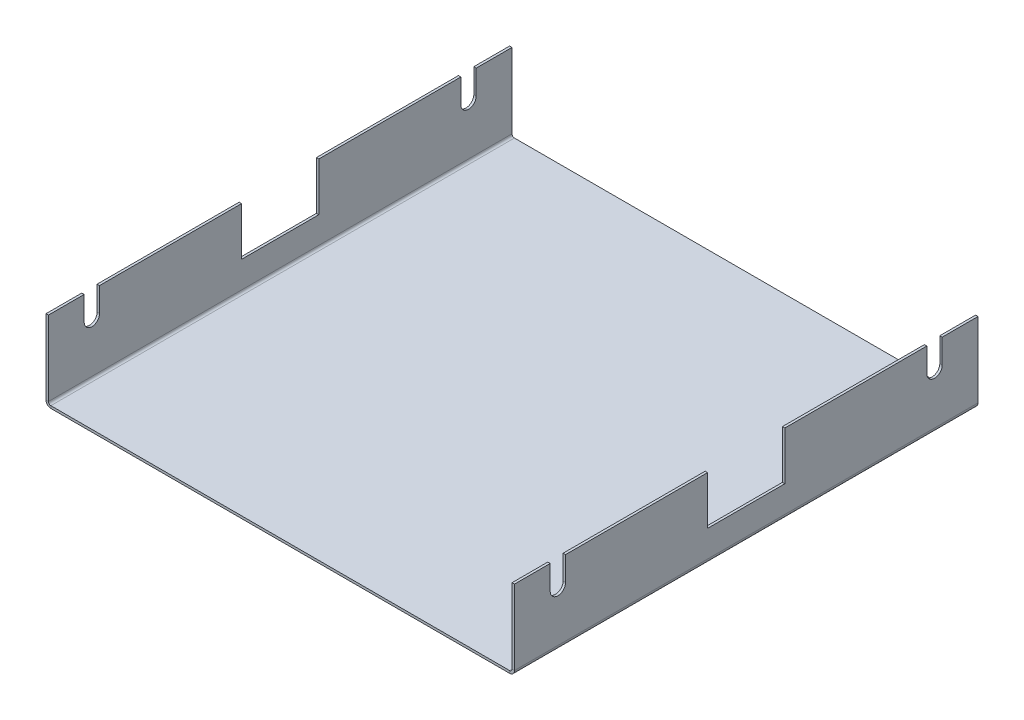
ISO-10303-21;
HEADER;
FILE_DESCRIPTION(('STEP AP214'),'2;1');
FILE_NAME('part.step','',(''),(''),'','','');
FILE_SCHEMA(('AUTOMOTIVE_DESIGN { 1 0 10303 214 1 1 1 1 }'));
ENDSEC;
DATA;
#1=APPLICATION_CONTEXT('core data for automotive mechanical design processes');
#2=APPLICATION_PROTOCOL_DEFINITION('international standard','automotive_design',2000,#1);
#3=PRODUCT_CONTEXT('',#1,'mechanical');
#4=PRODUCT('Part','Part','',(#3));
#5=PRODUCT_RELATED_PRODUCT_CATEGORY('part','',(#4));
#6=PRODUCT_DEFINITION_FORMATION('','',#4);
#7=PRODUCT_DEFINITION_CONTEXT('part definition',#1,'design');
#8=PRODUCT_DEFINITION('design','',#6,#7);
#9=PRODUCT_DEFINITION_SHAPE('','',#8);
#10=(LENGTH_UNIT() NAMED_UNIT(*) SI_UNIT(.MILLI.,.METRE.));
#11=(NAMED_UNIT(*) PLANE_ANGLE_UNIT() SI_UNIT($,.RADIAN.));
#12=(NAMED_UNIT(*) SI_UNIT($,.STERADIAN.) SOLID_ANGLE_UNIT());
#13=UNCERTAINTY_MEASURE_WITH_UNIT(LENGTH_MEASURE(1.E-05),#10,'distance_accuracy_value','');
#14=(GEOMETRIC_REPRESENTATION_CONTEXT(3) GLOBAL_UNCERTAINTY_ASSIGNED_CONTEXT((#13)) GLOBAL_UNIT_ASSIGNED_CONTEXT((#10,
#11,#12)) REPRESENTATION_CONTEXT('',''));
#15=CARTESIAN_POINT('',(0.,0.,0.));
#16=DIRECTION('',(0.,0.,1.));
#17=DIRECTION('',(1.,0.,0.));
#18=AXIS2_PLACEMENT_3D('',#15,#16,#17);
#19=CARTESIAN_POINT('',(-153.9875,50.8,152.4));
#20=DIRECTION('',(0.,1.,0.));
#21=DIRECTION('',(0.,0.,1.));
#22=AXIS2_PLACEMENT_3D('',#19,#20,#21);
#23=PLANE('',#22);
#24=DIRECTION('',(1.,0.,0.));
#25=VECTOR('',#24,1.);
#26=CARTESIAN_POINT('',(-153.9875,50.8,128.8669));
#27=LINE('',#26,#25);
#28=CARTESIAN_POINT('',(-153.9875,50.8,128.8669));
#29=VERTEX_POINT('',#28);
#30=CARTESIAN_POINT('',(-152.4,50.8,128.8669));
#31=VERTEX_POINT('',#30);
#32=EDGE_CURVE('E556',#29,#31,#27,.T.);
#33=ORIENTED_EDGE('',*,*,#32,.F.);
#34=DIRECTION('',(0.,0.,-1.));
#35=VECTOR('',#34,1.);
#36=CARTESIAN_POINT('',(-153.9875,50.8,152.4));
#37=LINE('',#36,#35);
#38=CARTESIAN_POINT('',(-153.9875,50.8,152.4));
#39=VERTEX_POINT('',#38);
#40=EDGE_CURVE('E288',#39,#29,#37,.T.);
#41=ORIENTED_EDGE('',*,*,#40,.F.);
#42=DIRECTION('',(1.,0.,0.));
#43=VECTOR('',#42,1.);
#44=CARTESIAN_POINT('',(-153.9875,50.8,152.4));
#45=LINE('',#44,#43);
#46=CARTESIAN_POINT('',(-152.4,50.8,152.4));
#47=VERTEX_POINT('',#46);
#48=EDGE_CURVE('E362',#39,#47,#45,.T.);
#49=ORIENTED_EDGE('',*,*,#48,.T.);
#50=DIRECTION('',(0.,0.,-1.));
#51=VECTOR('',#50,1.);
#52=CARTESIAN_POINT('',(-152.4,50.8,152.4));
#53=LINE('',#52,#51);
#54=EDGE_CURVE('E470',#47,#31,#53,.T.);
#55=ORIENTED_EDGE('',*,*,#54,.T.);
#56=EDGE_LOOP('',(#33,#41,#49,#55));
#57=FACE_BOUND('',#56,.T.);
#58=ADVANCED_FACE('F35',(#57),#23,.T.);
#59=CARTESIAN_POINT('',(152.4,50.8,152.4));
#60=DIRECTION('',(0.,1.,0.));
#61=DIRECTION('',(0.,0.,1.));
#62=AXIS2_PLACEMENT_3D('',#59,#60,#61);
#63=PLANE('',#62);
#64=CARTESIAN_POINT('',(152.4,50.8,128.8669));
#65=VERTEX_POINT('',#64);
#66=CARTESIAN_POINT('',(153.9875,50.8,128.8669));
#67=VERTEX_POINT('',#66);
#68=EDGE_CURVE('E584',#65,#67,#27,.T.);
#69=ORIENTED_EDGE('',*,*,#68,.F.);
#70=DIRECTION('',(0.,0.,-1.));
#71=VECTOR('',#70,1.);
#72=CARTESIAN_POINT('',(152.4,50.8,152.4));
#73=LINE('',#72,#71);
#74=CARTESIAN_POINT('',(152.4,50.8,152.4));
#75=VERTEX_POINT('',#74);
#76=EDGE_CURVE('E442',#75,#65,#73,.T.);
#77=ORIENTED_EDGE('',*,*,#76,.F.);
#78=DIRECTION('',(1.,0.,0.));
#79=VECTOR('',#78,1.);
#80=CARTESIAN_POINT('',(152.4,50.8,152.4));
#81=LINE('',#80,#79);
#82=CARTESIAN_POINT('',(153.9875,50.8,152.4));
#83=VERTEX_POINT('',#82);
#84=EDGE_CURVE('E380',#75,#83,#81,.T.);
#85=ORIENTED_EDGE('',*,*,#84,.T.);
#86=DIRECTION('',(0.,0.,-1.));
#87=VECTOR('',#86,1.);
#88=CARTESIAN_POINT('',(153.9875,50.8,152.4));
#89=LINE('',#88,#87);
#90=EDGE_CURVE('E448',#83,#67,#89,.T.);
#91=ORIENTED_EDGE('',*,*,#90,.T.);
#92=EDGE_LOOP('',(#69,#77,#85,#91));
#93=FACE_BOUND('',#92,.T.);
#94=ADVANCED_FACE('F631',(#93),#63,.T.);
#95=DIRECTION('',(1.,0.,0.));
#96=VECTOR('',#95,1.);
#97=CARTESIAN_POINT('',(-153.9875,50.8,-128.8669));
#98=LINE('',#97,#96);
#99=CARTESIAN_POINT('',(-153.9875,50.8,-128.8669));
#100=VERTEX_POINT('',#99);
#101=CARTESIAN_POINT('',(-152.4,50.8,-128.8669));
#102=VERTEX_POINT('',#101);
#103=EDGE_CURVE('E548',#100,#102,#98,.T.);
#104=ORIENTED_EDGE('',*,*,#103,.T.);
#105=CARTESIAN_POINT('',(-152.4,50.8,-152.4));
#106=VERTEX_POINT('',#105);
#107=EDGE_CURVE('E467',#102,#106,#53,.T.);
#108=ORIENTED_EDGE('',*,*,#107,.T.);
#109=DIRECTION('',(1.,0.,0.));
#110=VECTOR('',#109,1.);
#111=CARTESIAN_POINT('',(-153.9875,50.8,-152.4));
#112=LINE('',#111,#110);
#113=CARTESIAN_POINT('',(-153.9875,50.8,-152.4));
#114=VERTEX_POINT('',#113);
#115=EDGE_CURVE('E398',#114,#106,#112,.T.);
#116=ORIENTED_EDGE('',*,*,#115,.F.);
#117=EDGE_CURVE('E465',#100,#114,#37,.T.);
#118=ORIENTED_EDGE('',*,*,#117,.F.);
#119=EDGE_LOOP('',(#104,#108,#116,#118));
#120=FACE_BOUND('',#119,.T.);
#121=ADVANCED_FACE('F599',(#120),#23,.T.);
#122=CARTESIAN_POINT('',(152.4,50.8,-128.8669));
#123=VERTEX_POINT('',#122);
#124=CARTESIAN_POINT('',(153.9875,50.8,-128.8669));
#125=VERTEX_POINT('',#124);
#126=EDGE_CURVE('E551',#123,#125,#98,.T.);
#127=ORIENTED_EDGE('',*,*,#126,.T.);
#128=CARTESIAN_POINT('',(153.9875,50.8,-152.4));
#129=VERTEX_POINT('',#128);
#130=EDGE_CURVE('E445',#125,#129,#89,.T.);
#131=ORIENTED_EDGE('',*,*,#130,.T.);
#132=DIRECTION('',(1.,0.,0.));
#133=VECTOR('',#132,1.);
#134=CARTESIAN_POINT('',(152.4,50.8,-152.4));
#135=LINE('',#134,#133);
#136=CARTESIAN_POINT('',(152.4,50.8,-152.4));
#137=VERTEX_POINT('',#136);
#138=EDGE_CURVE('E416',#137,#129,#135,.T.);
#139=ORIENTED_EDGE('',*,*,#138,.F.);
#140=EDGE_CURVE('E441',#123,#137,#73,.T.);
#141=ORIENTED_EDGE('',*,*,#140,.F.);
#142=EDGE_LOOP('',(#127,#131,#139,#141));
#143=FACE_BOUND('',#142,.T.);
#144=ADVANCED_FACE('F639',(#143),#63,.T.);
#145=DIRECTION('',(1.,0.,0.));
#146=VECTOR('',#145,1.);
#147=CARTESIAN_POINT('',(-153.9875,50.8,118.7831));
#148=LINE('',#147,#146);
#149=CARTESIAN_POINT('',(-153.9875,50.8,118.7831));
#150=VERTEX_POINT('',#149);
#151=CARTESIAN_POINT('',(-152.4,50.8,118.7831));
#152=VERTEX_POINT('',#151);
#153=EDGE_CURVE('E581',#150,#152,#148,.T.);
#154=ORIENTED_EDGE('',*,*,#153,.T.);
#155=CARTESIAN_POINT('',(-152.4,50.8,25.4));
#156=VERTEX_POINT('',#155);
#157=EDGE_CURVE('E474',#152,#156,#53,.T.);
#158=ORIENTED_EDGE('',*,*,#157,.T.);
#159=DIRECTION('',(1.,0.,0.));
#160=VECTOR('',#159,1.);
#161=CARTESIAN_POINT('',(-153.9875,50.8,25.4));
#162=LINE('',#161,#160);
#163=CARTESIAN_POINT('',(-153.9875,50.8,25.4));
#164=VERTEX_POINT('',#163);
#165=EDGE_CURVE('E335',#164,#156,#162,.T.);
#166=ORIENTED_EDGE('',*,*,#165,.F.);
#167=EDGE_CURVE('E468',#150,#164,#37,.T.);
#168=ORIENTED_EDGE('',*,*,#167,.F.);
#169=EDGE_LOOP('',(#154,#158,#166,#168));
#170=FACE_BOUND('',#169,.T.);
#171=ADVANCED_FACE('F593',(#170),#23,.T.);
#172=CARTESIAN_POINT('',(152.4,50.8,118.7831));
#173=VERTEX_POINT('',#172);
#174=CARTESIAN_POINT('',(153.9875,50.8,118.7831));
#175=VERTEX_POINT('',#174);
#176=EDGE_CURVE('E580',#173,#175,#148,.T.);
#177=ORIENTED_EDGE('',*,*,#176,.T.);
#178=CARTESIAN_POINT('',(153.9875,50.8,25.4));
#179=VERTEX_POINT('',#178);
#180=EDGE_CURVE('E452',#175,#179,#89,.T.);
#181=ORIENTED_EDGE('',*,*,#180,.T.);
#182=CARTESIAN_POINT('',(152.4,50.8,25.4));
#183=VERTEX_POINT('',#182);
#184=EDGE_CURVE('E339',#183,#179,#162,.T.);
#185=ORIENTED_EDGE('',*,*,#184,.F.);
#186=EDGE_CURVE('E446',#173,#183,#73,.T.);
#187=ORIENTED_EDGE('',*,*,#186,.F.);
#188=EDGE_LOOP('',(#177,#181,#185,#187));
#189=FACE_BOUND('',#188,.T.);
#190=ADVANCED_FACE('F651',(#189),#63,.T.);
#191=CARTESIAN_POINT('',(152.4,1.5875,152.4));
#192=DIRECTION('',(0.,0.,1.));
#193=DIRECTION('',(1.,0.,0.));
#194=AXIS2_PLACEMENT_3D('',#191,#192,#193);
#195=PLANE('',#194);
#196=DIRECTION('',(1.,0.,0.));
#197=VECTOR('',#196,1.);
#198=CARTESIAN_POINT('',(152.4,1.5875,152.4));
#199=LINE('',#198,#197);
#200=CARTESIAN_POINT('',(152.4,1.5875,152.4));
#201=VERTEX_POINT('',#200);
#202=CARTESIAN_POINT('',(153.9875,1.5875,152.4));
#203=VERTEX_POINT('',#202);
#204=EDGE_CURVE('E489',#201,#203,#199,.T.);
#205=ORIENTED_EDGE('',*,*,#204,.F.);
#206=CARTESIAN_POINT('',(150.8125,1.5875,152.4));
#207=DIRECTION('',(0.,0.,1.));
#208=DIRECTION('',(1.,0.,0.));
#209=AXIS2_PLACEMENT_3D('',#206,#207,#208);
#210=CIRCLE('',#209,1.5875);
#211=CARTESIAN_POINT('',(150.8125,0.,152.4));
#212=VERTEX_POINT('',#211);
#213=EDGE_CURVE('E386',#201,#212,#210,.F.);
#214=ORIENTED_EDGE('',*,*,#213,.T.);
#215=DIRECTION('',(0.,1.,0.));
#216=VECTOR('',#215,1.);
#217=CARTESIAN_POINT('',(150.8125,-1.5875,152.4));
#218=LINE('',#217,#216);
#219=CARTESIAN_POINT('',(150.8125,-1.5875,152.4));
#220=VERTEX_POINT('',#219);
#221=EDGE_CURVE('E487',#220,#212,#218,.T.);
#222=ORIENTED_EDGE('',*,*,#221,.F.);
#223=CARTESIAN_POINT('',(150.8125,1.5875,152.4));
#224=DIRECTION('',(0.,0.,1.));
#225=DIRECTION('',(1.,0.,0.));
#226=AXIS2_PLACEMENT_3D('',#223,#224,#225);
#227=CIRCLE('',#226,3.175);
#228=EDGE_CURVE('E374',#203,#220,#227,.F.);
#229=ORIENTED_EDGE('',*,*,#228,.F.);
#230=EDGE_LOOP('',(#205,#214,#222,#229));
#231=FACE_BOUND('',#230,.T.);
#232=ADVANCED_FACE('F37',(#231),#195,.T.);
#233=CARTESIAN_POINT('',(150.8125,-1.5875,152.4));
#234=DIRECTION('',(0.,0.,1.));
#235=DIRECTION('',(1.,0.,0.));
#236=AXIS2_PLACEMENT_3D('',#233,#234,#235);
#237=PLANE('',#236);
#238=DIRECTION('',(0.,-1.,0.));
#239=VECTOR('',#238,1.);
#240=CARTESIAN_POINT('',(152.4,0.,152.4));
#241=LINE('',#240,#239);
#242=EDGE_CURVE('E383',#75,#201,#241,.T.);
#243=ORIENTED_EDGE('',*,*,#242,.T.);
#244=ORIENTED_EDGE('',*,*,#204,.T.);
#245=DIRECTION('',(0.,1.,0.));
#246=VECTOR('',#245,1.);
#247=CARTESIAN_POINT('',(153.9875,0.,152.4));
#248=LINE('',#247,#246);
#249=EDGE_CURVE('E377',#83,#203,#248,.F.);
#250=ORIENTED_EDGE('',*,*,#249,.F.);
#251=ORIENTED_EDGE('',*,*,#84,.F.);
#252=EDGE_LOOP('',(#243,#244,#250,#251));
#253=FACE_BOUND('',#252,.T.);
#254=ADVANCED_FACE('F946',(#253),#237,.T.);
#255=CARTESIAN_POINT('',(150.8125,0.,-152.4));
#256=DIRECTION('',(0.,0.,-1.));
#257=DIRECTION('',(-1.,0.,0.));
#258=AXIS2_PLACEMENT_3D('',#255,#256,#257);
#259=PLANE('',#258);
#260=DIRECTION('',(0.,-1.,0.));
#261=VECTOR('',#260,1.);
#262=CARTESIAN_POINT('',(150.8125,0.,-152.4));
#263=LINE('',#262,#261);
#264=CARTESIAN_POINT('',(150.8125,0.,-152.4));
#265=VERTEX_POINT('',#264);
#266=CARTESIAN_POINT('',(150.8125,-1.5875,-152.4));
#267=VERTEX_POINT('',#266);
#268=EDGE_CURVE('E485',#265,#267,#263,.T.);
#269=ORIENTED_EDGE('',*,*,#268,.F.);
#270=CARTESIAN_POINT('',(150.8125,1.5875,-152.4));
#271=DIRECTION('',(0.,0.,1.));
#272=DIRECTION('',(1.,0.,0.));
#273=AXIS2_PLACEMENT_3D('',#270,#271,#272);
#274=CIRCLE('',#273,1.5875);
#275=CARTESIAN_POINT('',(152.4,1.5875,-152.4));
#276=VERTEX_POINT('',#275);
#277=EDGE_CURVE('E422',#276,#265,#274,.F.);
#278=ORIENTED_EDGE('',*,*,#277,.F.);
#279=DIRECTION('',(-1.,0.,0.));
#280=VECTOR('',#279,1.);
#281=CARTESIAN_POINT('',(153.9875,1.5875,-152.4));
#282=LINE('',#281,#280);
#283=CARTESIAN_POINT('',(153.9875,1.5875,-152.4));
#284=VERTEX_POINT('',#283);
#285=EDGE_CURVE('E483',#284,#276,#282,.T.);
#286=ORIENTED_EDGE('',*,*,#285,.F.);
#287=CARTESIAN_POINT('',(150.8125,1.5875,-152.4));
#288=DIRECTION('',(0.,0.,1.));
#289=DIRECTION('',(1.,0.,0.));
#290=AXIS2_PLACEMENT_3D('',#287,#288,#289);
#291=CIRCLE('',#290,3.175);
#292=EDGE_CURVE('E410',#284,#267,#291,.F.);
#293=ORIENTED_EDGE('',*,*,#292,.T.);
#294=EDGE_LOOP('',(#269,#278,#286,#293));
#295=FACE_BOUND('',#294,.T.);
#296=ADVANCED_FACE('F952',(#295),#259,.T.);
#297=CARTESIAN_POINT('',(153.9875,1.5875,-152.4));
#298=DIRECTION('',(0.,0.,-1.));
#299=DIRECTION('',(-1.,0.,0.));
#300=AXIS2_PLACEMENT_3D('',#297,#298,#299);
#301=PLANE('',#300);
#302=DIRECTION('',(-1.,0.,0.));
#303=VECTOR('',#302,1.);
#304=CARTESIAN_POINT('',(-152.4,0.,-152.4));
#305=LINE('',#304,#303);
#306=CARTESIAN_POINT('',(-150.8125,0.,-152.4));
#307=VERTEX_POINT('',#306);
#308=EDGE_CURVE('E425',#265,#307,#305,.T.);
#309=ORIENTED_EDGE('',*,*,#308,.F.);
#310=ORIENTED_EDGE('',*,*,#268,.T.);
#311=DIRECTION('',(1.,0.,0.));
#312=VECTOR('',#311,1.);
#313=CARTESIAN_POINT('',(-152.4,-1.5875,-152.4));
#314=LINE('',#313,#312);
#315=CARTESIAN_POINT('',(-150.8125,-1.5875,-152.4));
#316=VERTEX_POINT('',#315);
#317=EDGE_CURVE('E407',#267,#316,#314,.F.);
#318=ORIENTED_EDGE('',*,*,#317,.T.);
#319=DIRECTION('',(0.,1.,0.));
#320=VECTOR('',#319,1.);
#321=CARTESIAN_POINT('',(-150.8125,-1.5875,-152.4));
#322=LINE('',#321,#320);
#323=EDGE_CURVE('E473',#316,#307,#322,.T.);
#324=ORIENTED_EDGE('',*,*,#323,.T.);
#325=EDGE_LOOP('',(#309,#310,#318,#324));
#326=FACE_BOUND('',#325,.T.);
#327=ADVANCED_FACE('F957',(#326),#301,.T.);
#328=CARTESIAN_POINT('',(-150.8125,0.,152.4));
#329=DIRECTION('',(0.,0.,1.));
#330=DIRECTION('',(1.,0.,0.));
#331=AXIS2_PLACEMENT_3D('',#328,#329,#330);
#332=PLANE('',#331);
#333=DIRECTION('',(0.,-1.,0.));
#334=VECTOR('',#333,1.);
#335=CARTESIAN_POINT('',(-150.8125,0.,152.4));
#336=LINE('',#335,#334);
#337=CARTESIAN_POINT('',(-150.8125,0.,152.4));
#338=VERTEX_POINT('',#337);
#339=CARTESIAN_POINT('',(-150.8125,-1.5875,152.4));
#340=VERTEX_POINT('',#339);
#341=EDGE_CURVE('E481',#338,#340,#336,.T.);
#342=ORIENTED_EDGE('',*,*,#341,.F.);
#343=CARTESIAN_POINT('',(-150.8125,1.5875,152.4));
#344=DIRECTION('',(0.,0.,1.));
#345=DIRECTION('',(1.,0.,0.));
#346=AXIS2_PLACEMENT_3D('',#343,#344,#345);
#347=CIRCLE('',#346,1.5875);
#348=CARTESIAN_POINT('',(-152.4,1.5875,152.4));
#349=VERTEX_POINT('',#348);
#350=EDGE_CURVE('E392',#338,#349,#347,.F.);
#351=ORIENTED_EDGE('',*,*,#350,.T.);
#352=DIRECTION('',(1.,0.,0.));
#353=VECTOR('',#352,1.);
#354=CARTESIAN_POINT('',(-153.9875,1.5875,152.4));
#355=LINE('',#354,#353);
#356=CARTESIAN_POINT('',(-153.9875,1.5875,152.4));
#357=VERTEX_POINT('',#356);
#358=EDGE_CURVE('E479',#357,#349,#355,.T.);
#359=ORIENTED_EDGE('',*,*,#358,.F.);
#360=CARTESIAN_POINT('',(-150.8125,1.5875,152.4));
#361=DIRECTION('',(0.,0.,1.));
#362=DIRECTION('',(1.,0.,0.));
#363=AXIS2_PLACEMENT_3D('',#360,#361,#362);
#364=CIRCLE('',#363,3.175);
#365=EDGE_CURVE('E368',#340,#357,#364,.F.);
#366=ORIENTED_EDGE('',*,*,#365,.F.);
#367=EDGE_LOOP('',(#342,#351,#359,#366));
#368=FACE_BOUND('',#367,.T.);
#369=ADVANCED_FACE('F972',(#368),#332,.T.);
#370=CARTESIAN_POINT('',(-153.9875,1.5875,152.4));
#371=DIRECTION('',(0.,0.,1.));
#372=DIRECTION('',(1.,0.,0.));
#373=AXIS2_PLACEMENT_3D('',#370,#371,#372);
#374=PLANE('',#373);
#375=DIRECTION('',(-1.,0.,0.));
#376=VECTOR('',#375,1.);
#377=CARTESIAN_POINT('',(-152.4,0.,152.4));
#378=LINE('',#377,#376);
#379=EDGE_CURVE('E389',#212,#338,#378,.T.);
#380=ORIENTED_EDGE('',*,*,#379,.T.);
#381=ORIENTED_EDGE('',*,*,#341,.T.);
#382=DIRECTION('',(1.,0.,0.));
#383=VECTOR('',#382,1.);
#384=CARTESIAN_POINT('',(-152.4,-1.5875,152.4));
#385=LINE('',#384,#383);
#386=EDGE_CURVE('E371',#220,#340,#385,.F.);
#387=ORIENTED_EDGE('',*,*,#386,.F.);
#388=ORIENTED_EDGE('',*,*,#221,.T.);
#389=EDGE_LOOP('',(#380,#381,#387,#388));
#390=FACE_BOUND('',#389,.T.);
#391=ADVANCED_FACE('F977',(#390),#374,.T.);
#392=CARTESIAN_POINT('',(-152.4,1.5875,-152.4));
#393=DIRECTION('',(0.,0.,-1.));
#394=DIRECTION('',(-1.,0.,0.));
#395=AXIS2_PLACEMENT_3D('',#392,#393,#394);
#396=PLANE('',#395);
#397=DIRECTION('',(-1.,0.,0.));
#398=VECTOR('',#397,1.);
#399=CARTESIAN_POINT('',(-152.4,1.5875,-152.4));
#400=LINE('',#399,#398);
#401=CARTESIAN_POINT('',(-152.4,1.5875,-152.4));
#402=VERTEX_POINT('',#401);
#403=CARTESIAN_POINT('',(-153.9875,1.5875,-152.4));
#404=VERTEX_POINT('',#403);
#405=EDGE_CURVE('E477',#402,#404,#400,.T.);
#406=ORIENTED_EDGE('',*,*,#405,.F.);
#407=CARTESIAN_POINT('',(-150.8125,1.5875,-152.4));
#408=DIRECTION('',(0.,0.,1.));
#409=DIRECTION('',(1.,0.,0.));
#410=AXIS2_PLACEMENT_3D('',#407,#408,#409);
#411=CIRCLE('',#410,1.5875);
#412=EDGE_CURVE('E363',#307,#402,#411,.F.);
#413=ORIENTED_EDGE('',*,*,#412,.F.);
#414=ORIENTED_EDGE('',*,*,#323,.F.);
#415=CARTESIAN_POINT('',(-150.8125,1.5875,-152.4));
#416=DIRECTION('',(0.,0.,1.));
#417=DIRECTION('',(1.,0.,0.));
#418=AXIS2_PLACEMENT_3D('',#415,#416,#417);
#419=CIRCLE('',#418,3.175);
#420=EDGE_CURVE('E404',#316,#404,#419,.F.);
#421=ORIENTED_EDGE('',*,*,#420,.T.);
#422=EDGE_LOOP('',(#406,#413,#414,#421));
#423=FACE_BOUND('',#422,.T.);
#424=ADVANCED_FACE('F984',(#423),#396,.T.);
#425=CARTESIAN_POINT('',(-150.8125,-1.5875,-152.4));
#426=DIRECTION('',(0.,0.,-1.));
#427=DIRECTION('',(-1.,0.,0.));
#428=AXIS2_PLACEMENT_3D('',#425,#426,#427);
#429=PLANE('',#428);
#430=DIRECTION('',(0.,1.,0.));
#431=VECTOR('',#430,1.);
#432=CARTESIAN_POINT('',(-152.4,0.,-152.4));
#433=LINE('',#432,#431);
#434=EDGE_CURVE('E359',#402,#106,#433,.T.);
#435=ORIENTED_EDGE('',*,*,#434,.F.);
#436=ORIENTED_EDGE('',*,*,#405,.T.);
#437=DIRECTION('',(0.,1.,0.));
#438=VECTOR('',#437,1.);
#439=CARTESIAN_POINT('',(-153.9875,0.,-152.4));
#440=LINE('',#439,#438);
#441=EDGE_CURVE('E401',#404,#114,#440,.T.);
#442=ORIENTED_EDGE('',*,*,#441,.T.);
#443=ORIENTED_EDGE('',*,*,#115,.T.);
#444=EDGE_LOOP('',(#435,#436,#442,#443));
#445=FACE_BOUND('',#444,.T.);
#446=ADVANCED_FACE('F602',(#445),#429,.T.);
#447=CARTESIAN_POINT('',(-152.4,0.,152.4));
#448=DIRECTION('',(-1.,0.,0.));
#449=DIRECTION('',(0.,0.,1.));
#450=AXIS2_PLACEMENT_3D('',#447,#448,#449);
#451=PLANE('',#450);
#452=CARTESIAN_POINT('',(-152.4,34.925,123.825));
#453=DIRECTION('',(-1.,0.,0.));
#454=DIRECTION('',(0.,0.,1.));
#455=AXIS2_PLACEMENT_3D('',#452,#453,#454);
#456=CIRCLE('',#455,5.04189999999995);
#457=CARTESIAN_POINT('',(-152.4,34.925,118.7831));
#458=VERTEX_POINT('',#457);
#459=CARTESIAN_POINT('',(-152.4,34.925,128.8669));
#460=VERTEX_POINT('',#459);
#461=EDGE_CURVE('E293',#458,#460,#456,.T.);
#462=ORIENTED_EDGE('',*,*,#461,.T.);
#463=DIRECTION('',(0.,1.,0.));
#464=VECTOR('',#463,1.);
#465=CARTESIAN_POINT('',(-152.4,0.,128.8669));
#466=LINE('',#465,#464);
#467=EDGE_CURVE('E273',#460,#31,#466,.T.);
#468=ORIENTED_EDGE('',*,*,#467,.T.);
#469=ORIENTED_EDGE('',*,*,#54,.F.);
#470=DIRECTION('',(0.,1.,0.));
#471=VECTOR('',#470,1.);
#472=CARTESIAN_POINT('',(-152.4,0.,152.4));
#473=LINE('',#472,#471);
#474=EDGE_CURVE('E360',#349,#47,#473,.T.);
#475=ORIENTED_EDGE('',*,*,#474,.F.);
#476=DIRECTION('',(0.,0.,-1.));
#477=VECTOR('',#476,1.);
#478=CARTESIAN_POINT('',(-152.4,1.5875,152.4));
#479=LINE('',#478,#477);
#480=EDGE_CURVE('E395',#349,#402,#479,.T.);
#481=ORIENTED_EDGE('',*,*,#480,.T.);
#482=ORIENTED_EDGE('',*,*,#434,.T.);
#483=ORIENTED_EDGE('',*,*,#107,.F.);
#484=DIRECTION('',(0.,-1.,0.));
#485=VECTOR('',#484,1.);
#486=CARTESIAN_POINT('',(-152.4,0.,-128.8669));
#487=LINE('',#486,#485);
#488=CARTESIAN_POINT('',(-152.4,34.925,-128.8669));
#489=VERTEX_POINT('',#488);
#490=EDGE_CURVE('E299',#102,#489,#487,.T.);
#491=ORIENTED_EDGE('',*,*,#490,.T.);
#492=CARTESIAN_POINT('',(-152.4,34.925,-123.825));
#493=DIRECTION('',(-1.,0.,0.));
#494=DIRECTION('',(0.,0.,1.));
#495=AXIS2_PLACEMENT_3D('',#492,#493,#494);
#496=CIRCLE('',#495,5.04189999999995);
#497=CARTESIAN_POINT('',(-152.4,34.925,-118.7831));
#498=VERTEX_POINT('',#497);
#499=EDGE_CURVE('E314',#489,#498,#496,.T.);
#500=ORIENTED_EDGE('',*,*,#499,.T.);
#501=DIRECTION('',(0.,1.,0.));
#502=VECTOR('',#501,1.);
#503=CARTESIAN_POINT('',(-152.4,0.,-118.7831));
#504=LINE('',#503,#502);
#505=CARTESIAN_POINT('',(-152.4,50.8,-118.7831));
#506=VERTEX_POINT('',#505);
#507=EDGE_CURVE('E50',#498,#506,#504,.T.);
#508=ORIENTED_EDGE('',*,*,#507,.T.);
#509=CARTESIAN_POINT('',(-152.4,50.8,-25.4));
#510=VERTEX_POINT('',#509);
#511=EDGE_CURVE('E475',#510,#506,#53,.T.);
#512=ORIENTED_EDGE('',*,*,#511,.F.);
#513=DIRECTION('',(0.,-1.,0.));
#514=VECTOR('',#513,1.);
#515=CARTESIAN_POINT('',(-152.4,0.,-25.4));
#516=LINE('',#515,#514);
#517=CARTESIAN_POINT('',(-152.4,19.05,-25.4));
#518=VERTEX_POINT('',#517);
#519=EDGE_CURVE('E353',#510,#518,#516,.T.);
#520=ORIENTED_EDGE('',*,*,#519,.T.);
#521=DIRECTION('',(0.,0.,1.));
#522=VECTOR('',#521,1.);
#523=CARTESIAN_POINT('',(-152.4,19.05,152.4));
#524=LINE('',#523,#522);
#525=CARTESIAN_POINT('',(-152.4,19.05,25.4));
#526=VERTEX_POINT('',#525);
#527=EDGE_CURVE('E338',#518,#526,#524,.T.);
#528=ORIENTED_EDGE('',*,*,#527,.T.);
#529=DIRECTION('',(0.,1.,0.));
#530=VECTOR('',#529,1.);
#531=CARTESIAN_POINT('',(-152.4,0.,25.4));
#532=LINE('',#531,#530);
#533=EDGE_CURVE('E356',#526,#156,#532,.T.);
#534=ORIENTED_EDGE('',*,*,#533,.T.);
#535=ORIENTED_EDGE('',*,*,#157,.F.);
#536=DIRECTION('',(0.,-1.,0.));
#537=VECTOR('',#536,1.);
#538=CARTESIAN_POINT('',(-152.4,0.,118.7831));
#539=LINE('',#538,#537);
#540=EDGE_CURVE('E555',#152,#458,#539,.T.);
#541=ORIENTED_EDGE('',*,*,#540,.T.);
#542=EDGE_LOOP('',(#462,#468,#469,#475,#481,#482,#483,#491,#500,#508,#512,#520,#528,#534,#535,#541));
#543=FACE_BOUND('',#542,.T.);
#544=ADVANCED_FACE('F568',(#543),#451,.F.);
#545=DIRECTION('',(1.,0.,0.));
#546=VECTOR('',#545,1.);
#547=CARTESIAN_POINT('',(-153.9875,50.8,-118.7831));
#548=LINE('',#547,#546);
#549=CARTESIAN_POINT('',(-153.9875,50.8,-118.7831));
#550=VERTEX_POINT('',#549);
#551=EDGE_CURVE('E545',#550,#506,#548,.T.);
#552=ORIENTED_EDGE('',*,*,#551,.F.);
#553=CARTESIAN_POINT('',(-153.9875,50.8,-25.4));
#554=VERTEX_POINT('',#553);
#555=EDGE_CURVE('E469',#554,#550,#37,.T.);
#556=ORIENTED_EDGE('',*,*,#555,.F.);
#557=DIRECTION('',(1.,0.,0.));
#558=VECTOR('',#557,1.);
#559=CARTESIAN_POINT('',(-153.9875,50.8,-25.4));
#560=LINE('',#559,#558);
#561=EDGE_CURVE('E340',#554,#510,#560,.T.);
#562=ORIENTED_EDGE('',*,*,#561,.T.);
#563=ORIENTED_EDGE('',*,*,#511,.T.);
#564=EDGE_LOOP('',(#552,#556,#562,#563));
#565=FACE_BOUND('',#564,.T.);
#566=ADVANCED_FACE('F633',(#565),#23,.T.);
#567=CARTESIAN_POINT('',(-153.9875,0.,152.4));
#568=DIRECTION('',(-1.,0.,0.));
#569=DIRECTION('',(0.,0.,1.));
#570=AXIS2_PLACEMENT_3D('',#567,#568,#569);
#571=PLANE('',#570);
#572=DIRECTION('',(0.,-1.,0.));
#573=VECTOR('',#572,1.);
#574=CARTESIAN_POINT('',(-153.9875,50.8,128.8669));
#575=LINE('',#574,#573);
#576=CARTESIAN_POINT('',(-153.9875,34.925,128.8669));
#577=VERTEX_POINT('',#576);
#578=EDGE_CURVE('E270',#29,#577,#575,.T.);
#579=ORIENTED_EDGE('',*,*,#578,.T.);
#580=CARTESIAN_POINT('',(-153.9875,34.925,123.825));
#581=DIRECTION('',(1.,0.,0.));
#582=DIRECTION('',(0.,0.,-1.));
#583=AXIS2_PLACEMENT_3D('',#580,#581,#582);
#584=CIRCLE('',#583,5.04189999999989);
#585=CARTESIAN_POINT('',(-153.9875,34.925,118.7831));
#586=VERTEX_POINT('',#585);
#587=EDGE_CURVE('E286',#577,#586,#584,.T.);
#588=ORIENTED_EDGE('',*,*,#587,.T.);
#589=DIRECTION('',(0.,1.,0.));
#590=VECTOR('',#589,1.);
#591=CARTESIAN_POINT('',(-153.9875,50.8,118.7831));
#592=LINE('',#591,#590);
#593=EDGE_CURVE('E279',#586,#150,#592,.T.);
#594=ORIENTED_EDGE('',*,*,#593,.T.);
#595=ORIENTED_EDGE('',*,*,#167,.T.);
#596=DIRECTION('',(0.,-1.,0.));
#597=VECTOR('',#596,1.);
#598=CARTESIAN_POINT('',(-153.9875,50.8,25.4));
#599=LINE('',#598,#597);
#600=CARTESIAN_POINT('',(-153.9875,19.05,25.4));
#601=VERTEX_POINT('',#600);
#602=EDGE_CURVE('E318',#164,#601,#599,.T.);
#603=ORIENTED_EDGE('',*,*,#602,.T.);
#604=DIRECTION('',(0.,0.,-1.));
#605=VECTOR('',#604,1.);
#606=CARTESIAN_POINT('',(-153.9875,19.05,25.4));
#607=LINE('',#606,#605);
#608=CARTESIAN_POINT('',(-153.9875,19.05,-25.4));
#609=VERTEX_POINT('',#608);
#610=EDGE_CURVE('E321',#601,#609,#607,.T.);
#611=ORIENTED_EDGE('',*,*,#610,.T.);
#612=DIRECTION('',(0.,1.,0.));
#613=VECTOR('',#612,1.);
#614=CARTESIAN_POINT('',(-153.9875,50.8,-25.4));
#615=LINE('',#614,#613);
#616=EDGE_CURVE('E325',#609,#554,#615,.T.);
#617=ORIENTED_EDGE('',*,*,#616,.T.);
#618=ORIENTED_EDGE('',*,*,#555,.T.);
#619=DIRECTION('',(0.,-1.,0.));
#620=VECTOR('',#619,1.);
#621=CARTESIAN_POINT('',(-153.9875,50.8,-118.7831));
#622=LINE('',#621,#620);
#623=CARTESIAN_POINT('',(-153.9875,34.925,-118.7831));
#624=VERTEX_POINT('',#623);
#625=EDGE_CURVE('E537',#550,#624,#622,.T.);
#626=ORIENTED_EDGE('',*,*,#625,.T.);
#627=CARTESIAN_POINT('',(-153.9875,34.925,-123.825));
#628=DIRECTION('',(1.,0.,0.));
#629=DIRECTION('',(0.,0.,-1.));
#630=AXIS2_PLACEMENT_3D('',#627,#628,#629);
#631=CIRCLE('',#630,5.04189999999989);
#632=CARTESIAN_POINT('',(-153.9875,34.925,-128.8669));
#633=VERTEX_POINT('',#632);
#634=EDGE_CURVE('E308',#624,#633,#631,.T.);
#635=ORIENTED_EDGE('',*,*,#634,.T.);
#636=DIRECTION('',(0.,1.,0.));
#637=VECTOR('',#636,1.);
#638=CARTESIAN_POINT('',(-153.9875,50.8,-128.8669));
#639=LINE('',#638,#637);
#640=EDGE_CURVE('E58',#633,#100,#639,.T.);
#641=ORIENTED_EDGE('',*,*,#640,.T.);
#642=ORIENTED_EDGE('',*,*,#117,.T.);
#643=ORIENTED_EDGE('',*,*,#441,.F.);
#644=DIRECTION('',(0.,0.,-1.));
#645=VECTOR('',#644,1.);
#646=CARTESIAN_POINT('',(-153.9875,1.5875,152.4));
#647=LINE('',#646,#645);
#648=EDGE_CURVE('E462',#357,#404,#647,.T.);
#649=ORIENTED_EDGE('',*,*,#648,.F.);
#650=DIRECTION('',(0.,1.,0.));
#651=VECTOR('',#650,1.);
#652=CARTESIAN_POINT('',(-153.9875,0.,152.4));
#653=LINE('',#652,#651);
#654=EDGE_CURVE('E366',#357,#39,#653,.T.);
#655=ORIENTED_EDGE('',*,*,#654,.T.);
#656=ORIENTED_EDGE('',*,*,#40,.T.);
#657=EDGE_LOOP('',(#579,#588,#594,#595,#603,#611,#617,#618,#626,#635,#641,#642,#643,#649,#655,#656));
#658=FACE_BOUND('',#657,.T.);
#659=ADVANCED_FACE('F284',(#658),#571,.T.);
#660=CARTESIAN_POINT('',(-150.8125,1.5875,152.4));
#661=DIRECTION('',(0.,0.,-1.));
#662=DIRECTION('',(-1.,0.,0.));
#663=AXIS2_PLACEMENT_3D('',#660,#661,#662);
#664=CYLINDRICAL_SURFACE('',#663,3.175);
#665=ORIENTED_EDGE('',*,*,#420,.F.);
#666=DIRECTION('',(0.,0.,-1.));
#667=VECTOR('',#666,1.);
#668=CARTESIAN_POINT('',(-150.8125,-1.5875,152.4));
#669=LINE('',#668,#667);
#670=EDGE_CURVE('E459',#340,#316,#669,.T.);
#671=ORIENTED_EDGE('',*,*,#670,.F.);
#672=ORIENTED_EDGE('',*,*,#365,.T.);
#673=ORIENTED_EDGE('',*,*,#648,.T.);
#674=EDGE_LOOP('',(#665,#671,#672,#673));
#675=FACE_BOUND('',#674,.T.);
#676=ADVANCED_FACE('F607',(#675),#664,.T.);
#677=CARTESIAN_POINT('',(-152.4,-1.5875,152.4));
#678=DIRECTION('',(0.,-1.,0.));
#679=DIRECTION('',(0.,0.,-1.));
#680=AXIS2_PLACEMENT_3D('',#677,#678,#679);
#681=PLANE('',#680);
#682=ORIENTED_EDGE('',*,*,#317,.F.);
#683=DIRECTION('',(0.,0.,-1.));
#684=VECTOR('',#683,1.);
#685=CARTESIAN_POINT('',(150.8125,-1.5875,152.4));
#686=LINE('',#685,#684);
#687=EDGE_CURVE('E456',#220,#267,#686,.T.);
#688=ORIENTED_EDGE('',*,*,#687,.F.);
#689=ORIENTED_EDGE('',*,*,#386,.T.);
#690=ORIENTED_EDGE('',*,*,#670,.T.);
#691=EDGE_LOOP('',(#682,#688,#689,#690));
#692=FACE_BOUND('',#691,.T.);
#693=ADVANCED_FACE('F670',(#692),#681,.T.);
#694=CARTESIAN_POINT('',(150.8125,1.5875,152.4));
#695=DIRECTION('',(0.,0.,-1.));
#696=DIRECTION('',(-1.,0.,0.));
#697=AXIS2_PLACEMENT_3D('',#694,#695,#696);
#698=CYLINDRICAL_SURFACE('',#697,3.175);
#699=ORIENTED_EDGE('',*,*,#292,.F.);
#700=DIRECTION('',(0.,0.,-1.));
#701=VECTOR('',#700,1.);
#702=CARTESIAN_POINT('',(153.9875,1.5875,152.4));
#703=LINE('',#702,#701);
#704=EDGE_CURVE('E451',#203,#284,#703,.T.);
#705=ORIENTED_EDGE('',*,*,#704,.F.);
#706=ORIENTED_EDGE('',*,*,#228,.T.);
#707=ORIENTED_EDGE('',*,*,#687,.T.);
#708=EDGE_LOOP('',(#699,#705,#706,#707));
#709=FACE_BOUND('',#708,.T.);
#710=ADVANCED_FACE('F667',(#709),#698,.T.);
#711=CARTESIAN_POINT('',(153.9875,0.,152.4));
#712=DIRECTION('',(1.,0.,0.));
#713=DIRECTION('',(0.,0.,-1.));
#714=AXIS2_PLACEMENT_3D('',#711,#712,#713);
#715=PLANE('',#714);
#716=DIRECTION('',(0.,-1.,0.));
#717=VECTOR('',#716,1.);
#718=CARTESIAN_POINT('',(153.9875,50.8,128.8669));
#719=LINE('',#718,#717);
#720=CARTESIAN_POINT('',(153.9875,34.925,128.8669));
#721=VERTEX_POINT('',#720);
#722=EDGE_CURVE('E542',#67,#721,#719,.T.);
#723=ORIENTED_EDGE('',*,*,#722,.F.);
#724=ORIENTED_EDGE('',*,*,#90,.F.);
#725=ORIENTED_EDGE('',*,*,#249,.T.);
#726=ORIENTED_EDGE('',*,*,#704,.T.);
#727=DIRECTION('',(0.,1.,0.));
#728=VECTOR('',#727,1.);
#729=CARTESIAN_POINT('',(153.9875,0.,-152.4));
#730=LINE('',#729,#728);
#731=EDGE_CURVE('E413',#129,#284,#730,.F.);
#732=ORIENTED_EDGE('',*,*,#731,.F.);
#733=ORIENTED_EDGE('',*,*,#130,.F.);
#734=DIRECTION('',(0.,1.,0.));
#735=VECTOR('',#734,1.);
#736=CARTESIAN_POINT('',(153.9875,50.8,-128.8669));
#737=LINE('',#736,#735);
#738=CARTESIAN_POINT('',(153.9875,34.925,-128.8669));
#739=VERTEX_POINT('',#738);
#740=EDGE_CURVE('E526',#739,#125,#737,.T.);
#741=ORIENTED_EDGE('',*,*,#740,.F.);
#742=CARTESIAN_POINT('',(153.9875,34.925,-123.825));
#743=DIRECTION('',(1.,0.,0.));
#744=DIRECTION('',(0.,0.,-1.));
#745=AXIS2_PLACEMENT_3D('',#742,#743,#744);
#746=CIRCLE('',#745,5.0419);
#747=CARTESIAN_POINT('',(153.9875,34.925,-118.7831));
#748=VERTEX_POINT('',#747);
#749=EDGE_CURVE('E305',#748,#739,#746,.T.);
#750=ORIENTED_EDGE('',*,*,#749,.F.);
#751=DIRECTION('',(0.,-1.,0.));
#752=VECTOR('',#751,1.);
#753=CARTESIAN_POINT('',(153.9875,50.8,-118.7831));
#754=LINE('',#753,#752);
#755=CARTESIAN_POINT('',(153.9875,50.8,-118.7831));
#756=VERTEX_POINT('',#755);
#757=EDGE_CURVE('E512',#756,#748,#754,.T.);
#758=ORIENTED_EDGE('',*,*,#757,.F.);
#759=CARTESIAN_POINT('',(153.9875,50.8,-25.4));
#760=VERTEX_POINT('',#759);
#761=EDGE_CURVE('E453',#760,#756,#89,.T.);
#762=ORIENTED_EDGE('',*,*,#761,.F.);
#763=DIRECTION('',(0.,1.,0.));
#764=VECTOR('',#763,1.);
#765=CARTESIAN_POINT('',(153.9875,50.8,-25.4));
#766=LINE('',#765,#764);
#767=CARTESIAN_POINT('',(153.9875,19.05,-25.4));
#768=VERTEX_POINT('',#767);
#769=EDGE_CURVE('E322',#768,#760,#766,.T.);
#770=ORIENTED_EDGE('',*,*,#769,.F.);
#771=DIRECTION('',(0.,0.,-1.));
#772=VECTOR('',#771,1.);
#773=CARTESIAN_POINT('',(153.9875,19.05,25.4));
#774=LINE('',#773,#772);
#775=CARTESIAN_POINT('',(153.9875,19.05,25.4));
#776=VERTEX_POINT('',#775);
#777=EDGE_CURVE('E331',#776,#768,#774,.T.);
#778=ORIENTED_EDGE('',*,*,#777,.F.);
#779=DIRECTION('',(0.,-1.,0.));
#780=VECTOR('',#779,1.);
#781=CARTESIAN_POINT('',(153.9875,50.8,25.4));
#782=LINE('',#781,#780);
#783=EDGE_CURVE('E317',#179,#776,#782,.T.);
#784=ORIENTED_EDGE('',*,*,#783,.F.);
#785=ORIENTED_EDGE('',*,*,#180,.F.);
#786=DIRECTION('',(0.,1.,0.));
#787=VECTOR('',#786,1.);
#788=CARTESIAN_POINT('',(153.9875,50.8,118.7831));
#789=LINE('',#788,#787);
#790=CARTESIAN_POINT('',(153.9875,34.925,118.7831));
#791=VERTEX_POINT('',#790);
#792=EDGE_CURVE('E289',#791,#175,#789,.T.);
#793=ORIENTED_EDGE('',*,*,#792,.F.);
#794=CARTESIAN_POINT('',(153.9875,34.925,123.825));
#795=DIRECTION('',(1.,0.,0.));
#796=DIRECTION('',(0.,0.,-1.));
#797=AXIS2_PLACEMENT_3D('',#794,#795,#796);
#798=CIRCLE('',#797,5.0419);
#799=EDGE_CURVE('E294',#721,#791,#798,.T.);
#800=ORIENTED_EDGE('',*,*,#799,.F.);
#801=EDGE_LOOP('',(#723,#724,#725,#726,#732,#733,#741,#750,#758,#762,#770,#778,#784,#785,#793,#800));
#802=FACE_BOUND('',#801,.T.);
#803=ADVANCED_FACE('F532',(#802),#715,.T.);
#804=CARTESIAN_POINT('',(152.4,50.8,-118.7831));
#805=VERTEX_POINT('',#804);
#806=EDGE_CURVE('E547',#805,#756,#548,.T.);
#807=ORIENTED_EDGE('',*,*,#806,.F.);
#808=CARTESIAN_POINT('',(152.4,50.8,-25.4));
#809=VERTEX_POINT('',#808);
#810=EDGE_CURVE('E447',#809,#805,#73,.T.);
#811=ORIENTED_EDGE('',*,*,#810,.F.);
#812=EDGE_CURVE('E343',#809,#760,#560,.T.);
#813=ORIENTED_EDGE('',*,*,#812,.T.);
#814=ORIENTED_EDGE('',*,*,#761,.T.);
#815=EDGE_LOOP('',(#807,#811,#813,#814));
#816=FACE_BOUND('',#815,.T.);
#817=ADVANCED_FACE('F640',(#816),#63,.T.);
#818=CARTESIAN_POINT('',(152.4,0.,152.4));
#819=DIRECTION('',(1.,0.,0.));
#820=DIRECTION('',(0.,0.,-1.));
#821=AXIS2_PLACEMENT_3D('',#818,#819,#820);
#822=PLANE('',#821);
#823=ORIENTED_EDGE('',*,*,#76,.T.);
#824=DIRECTION('',(0.,-1.,0.));
#825=VECTOR('',#824,1.);
#826=CARTESIAN_POINT('',(152.4,0.,128.8669));
#827=LINE('',#826,#825);
#828=CARTESIAN_POINT('',(152.4,34.925,128.8669));
#829=VERTEX_POINT('',#828);
#830=EDGE_CURVE('E559',#65,#829,#827,.T.);
#831=ORIENTED_EDGE('',*,*,#830,.T.);
#832=CARTESIAN_POINT('',(152.4,34.925,123.825));
#833=DIRECTION('',(1.,0.,0.));
#834=DIRECTION('',(0.,0.,-1.));
#835=AXIS2_PLACEMENT_3D('',#832,#833,#834);
#836=CIRCLE('',#835,5.04189999999995);
#837=CARTESIAN_POINT('',(152.4,34.925,118.7831));
#838=VERTEX_POINT('',#837);
#839=EDGE_CURVE('E296',#829,#838,#836,.T.);
#840=ORIENTED_EDGE('',*,*,#839,.T.);
#841=DIRECTION('',(0.,1.,0.));
#842=VECTOR('',#841,1.);
#843=CARTESIAN_POINT('',(152.4,0.,118.7831));
#844=LINE('',#843,#842);
#845=EDGE_CURVE('E552',#838,#173,#844,.T.);
#846=ORIENTED_EDGE('',*,*,#845,.T.);
#847=ORIENTED_EDGE('',*,*,#186,.T.);
#848=DIRECTION('',(0.,-1.,0.));
#849=VECTOR('',#848,1.);
#850=CARTESIAN_POINT('',(152.4,0.,25.4));
#851=LINE('',#850,#849);
#852=CARTESIAN_POINT('',(152.4,19.05,25.4));
#853=VERTEX_POINT('',#852);
#854=EDGE_CURVE('E497',#183,#853,#851,.T.);
#855=ORIENTED_EDGE('',*,*,#854,.T.);
#856=DIRECTION('',(0.,0.,-1.));
#857=VECTOR('',#856,1.);
#858=CARTESIAN_POINT('',(152.4,19.05,152.4));
#859=LINE('',#858,#857);
#860=CARTESIAN_POINT('',(152.4,19.05,-25.4));
#861=VERTEX_POINT('',#860);
#862=EDGE_CURVE('E491',#853,#861,#859,.T.);
#863=ORIENTED_EDGE('',*,*,#862,.T.);
#864=DIRECTION('',(0.,1.,0.));
#865=VECTOR('',#864,1.);
#866=CARTESIAN_POINT('',(152.4,0.,-25.4));
#867=LINE('',#866,#865);
#868=EDGE_CURVE('E494',#861,#809,#867,.T.);
#869=ORIENTED_EDGE('',*,*,#868,.T.);
#870=ORIENTED_EDGE('',*,*,#810,.T.);
#871=DIRECTION('',(0.,-1.,0.));
#872=VECTOR('',#871,1.);
#873=CARTESIAN_POINT('',(152.4,0.,-118.7831));
#874=LINE('',#873,#872);
#875=CARTESIAN_POINT('',(152.4,34.925,-118.7831));
#876=VERTEX_POINT('',#875);
#877=EDGE_CURVE('E509',#805,#876,#874,.T.);
#878=ORIENTED_EDGE('',*,*,#877,.T.);
#879=CARTESIAN_POINT('',(152.4,34.925,-123.825));
#880=DIRECTION('',(1.,0.,0.));
#881=DIRECTION('',(0.,0.,-1.));
#882=AXIS2_PLACEMENT_3D('',#879,#880,#881);
#883=CIRCLE('',#882,5.04189999999995);
#884=CARTESIAN_POINT('',(152.4,34.925,-128.8669));
#885=VERTEX_POINT('',#884);
#886=EDGE_CURVE('E311',#876,#885,#883,.T.);
#887=ORIENTED_EDGE('',*,*,#886,.T.);
#888=DIRECTION('',(0.,1.,0.));
#889=VECTOR('',#888,1.);
#890=CARTESIAN_POINT('',(152.4,0.,-128.8669));
#891=LINE('',#890,#889);
#892=EDGE_CURVE('E528',#885,#123,#891,.T.);
#893=ORIENTED_EDGE('',*,*,#892,.T.);
#894=ORIENTED_EDGE('',*,*,#140,.T.);
#895=DIRECTION('',(0.,-1.,0.));
#896=VECTOR('',#895,1.);
#897=CARTESIAN_POINT('',(152.4,0.,-152.4));
#898=LINE('',#897,#896);
#899=EDGE_CURVE('E419',#137,#276,#898,.T.);
#900=ORIENTED_EDGE('',*,*,#899,.T.);
#901=DIRECTION('',(0.,0.,-1.));
#902=VECTOR('',#901,1.);
#903=CARTESIAN_POINT('',(152.4,1.5875,152.4));
#904=LINE('',#903,#902);
#905=EDGE_CURVE('E438',#201,#276,#904,.T.);
#906=ORIENTED_EDGE('',*,*,#905,.F.);
#907=ORIENTED_EDGE('',*,*,#242,.F.);
#908=EDGE_LOOP('',(#823,#831,#840,#846,#847,#855,#863,#869,#870,#878,#887,#893,#894,#900,#906,#907));
#909=FACE_BOUND('',#908,.T.);
#910=ADVANCED_FACE('F518',(#909),#822,.F.);
#911=CARTESIAN_POINT('',(150.8125,1.5875,152.4));
#912=DIRECTION('',(0.,0.,-1.));
#913=DIRECTION('',(-1.,0.,0.));
#914=AXIS2_PLACEMENT_3D('',#911,#912,#913);
#915=CYLINDRICAL_SURFACE('',#914,1.5875);
#916=ORIENTED_EDGE('',*,*,#277,.T.);
#917=DIRECTION('',(0.,0.,-1.));
#918=VECTOR('',#917,1.);
#919=CARTESIAN_POINT('',(150.8125,0.,152.4));
#920=LINE('',#919,#918);
#921=EDGE_CURVE('E435',#212,#265,#920,.T.);
#922=ORIENTED_EDGE('',*,*,#921,.F.);
#923=ORIENTED_EDGE('',*,*,#213,.F.);
#924=ORIENTED_EDGE('',*,*,#905,.T.);
#925=EDGE_LOOP('',(#916,#922,#923,#924));
#926=FACE_BOUND('',#925,.T.);
#927=ADVANCED_FACE('F704',(#926),#915,.F.);
#928=CARTESIAN_POINT('',(-152.4,0.,152.4));
#929=DIRECTION('',(0.,-1.,0.));
#930=DIRECTION('',(0.,0.,-1.));
#931=AXIS2_PLACEMENT_3D('',#928,#929,#930);
#932=PLANE('',#931);
#933=ORIENTED_EDGE('',*,*,#308,.T.);
#934=DIRECTION('',(0.,0.,-1.));
#935=VECTOR('',#934,1.);
#936=CARTESIAN_POINT('',(-150.8125,0.,152.4));
#937=LINE('',#936,#935);
#938=EDGE_CURVE('E432',#338,#307,#937,.T.);
#939=ORIENTED_EDGE('',*,*,#938,.F.);
#940=ORIENTED_EDGE('',*,*,#379,.F.);
#941=ORIENTED_EDGE('',*,*,#921,.T.);
#942=EDGE_LOOP('',(#933,#939,#940,#941));
#943=FACE_BOUND('',#942,.T.);
#944=ADVANCED_FACE('F710',(#943),#932,.F.);
#945=CARTESIAN_POINT('',(-150.8125,1.5875,152.4));
#946=DIRECTION('',(0.,0.,-1.));
#947=DIRECTION('',(-1.,0.,0.));
#948=AXIS2_PLACEMENT_3D('',#945,#946,#947);
#949=CYLINDRICAL_SURFACE('',#948,1.5875);
#950=ORIENTED_EDGE('',*,*,#412,.T.);
#951=ORIENTED_EDGE('',*,*,#480,.F.);
#952=ORIENTED_EDGE('',*,*,#350,.F.);
#953=ORIENTED_EDGE('',*,*,#938,.T.);
#954=EDGE_LOOP('',(#950,#951,#952,#953));
#955=FACE_BOUND('',#954,.T.);
#956=ADVANCED_FACE('F717',(#955),#949,.F.);
#957=CARTESIAN_POINT('',(-150.8125,1.5875,152.4));
#958=DIRECTION('',(0.,0.,1.));
#959=DIRECTION('',(1.,0.,0.));
#960=AXIS2_PLACEMENT_3D('',#957,#958,#959);
#961=PLANE('',#960);
#962=ORIENTED_EDGE('',*,*,#474,.T.);
#963=ORIENTED_EDGE('',*,*,#48,.F.);
#964=ORIENTED_EDGE('',*,*,#654,.F.);
#965=ORIENTED_EDGE('',*,*,#358,.T.);
#966=EDGE_LOOP('',(#962,#963,#964,#965));
#967=FACE_BOUND('',#966,.T.);
#968=ADVANCED_FACE('F613',(#967),#961,.T.);
#969=CARTESIAN_POINT('',(-150.8125,1.5875,-152.4));
#970=DIRECTION('',(0.,0.,1.));
#971=DIRECTION('',(1.,0.,0.));
#972=AXIS2_PLACEMENT_3D('',#969,#970,#971);
#973=PLANE('',#972);
#974=ORIENTED_EDGE('',*,*,#731,.T.);
#975=ORIENTED_EDGE('',*,*,#285,.T.);
#976=ORIENTED_EDGE('',*,*,#899,.F.);
#977=ORIENTED_EDGE('',*,*,#138,.T.);
#978=EDGE_LOOP('',(#974,#975,#976,#977));
#979=FACE_BOUND('',#978,.T.);
#980=ADVANCED_FACE('F732',(#979),#973,.F.);
#981=CARTESIAN_POINT('',(-153.9875,19.05,25.4));
#982=DIRECTION('',(0.,-1.,0.));
#983=DIRECTION('',(0.,0.,-1.));
#984=AXIS2_PLACEMENT_3D('',#981,#982,#983);
#985=PLANE('',#984);
#986=DIRECTION('',(1.,0.,0.));
#987=VECTOR('',#986,1.);
#988=CARTESIAN_POINT('',(-153.9875,19.05,25.4));
#989=LINE('',#988,#987);
#990=EDGE_CURVE('E328',#853,#776,#989,.T.);
#991=ORIENTED_EDGE('',*,*,#990,.T.);
#992=ORIENTED_EDGE('',*,*,#777,.T.);
#993=DIRECTION('',(1.,0.,0.));
#994=VECTOR('',#993,1.);
#995=CARTESIAN_POINT('',(-153.9875,19.05,-25.4));
#996=LINE('',#995,#994);
#997=EDGE_CURVE('E347',#861,#768,#996,.T.);
#998=ORIENTED_EDGE('',*,*,#997,.F.);
#999=ORIENTED_EDGE('',*,*,#862,.F.);
#1000=EDGE_LOOP('',(#991,#992,#998,#999));
#1001=FACE_BOUND('',#1000,.T.);
#1002=ADVANCED_FACE('F739',(#1001),#985,.F.);
#1003=CARTESIAN_POINT('',(-153.9875,50.8,-25.4));
#1004=DIRECTION('',(0.,0.,-1.));
#1005=DIRECTION('',(0.,1.,0.));
#1006=AXIS2_PLACEMENT_3D('',#1003,#1004,#1005);
#1007=PLANE('',#1006);
#1008=ORIENTED_EDGE('',*,*,#997,.T.);
#1009=ORIENTED_EDGE('',*,*,#769,.T.);
#1010=ORIENTED_EDGE('',*,*,#812,.F.);
#1011=ORIENTED_EDGE('',*,*,#868,.F.);
#1012=EDGE_LOOP('',(#1008,#1009,#1010,#1011));
#1013=FACE_BOUND('',#1012,.T.);
#1014=ADVANCED_FACE('F747',(#1013),#1007,.F.);
#1015=CARTESIAN_POINT('',(-153.9875,50.8,25.4));
#1016=DIRECTION('',(0.,0.,1.));
#1017=DIRECTION('',(0.,-1.,0.));
#1018=AXIS2_PLACEMENT_3D('',#1015,#1016,#1017);
#1019=PLANE('',#1018);
#1020=ORIENTED_EDGE('',*,*,#184,.T.);
#1021=ORIENTED_EDGE('',*,*,#783,.T.);
#1022=ORIENTED_EDGE('',*,*,#990,.F.);
#1023=ORIENTED_EDGE('',*,*,#854,.F.);
#1024=EDGE_LOOP('',(#1020,#1021,#1022,#1023));
#1025=FACE_BOUND('',#1024,.T.);
#1026=ADVANCED_FACE('F756',(#1025),#1019,.F.);
#1027=EDGE_CURVE('E348',#601,#526,#989,.T.);
#1028=ORIENTED_EDGE('',*,*,#1027,.F.);
#1029=ORIENTED_EDGE('',*,*,#602,.F.);
#1030=ORIENTED_EDGE('',*,*,#165,.T.);
#1031=ORIENTED_EDGE('',*,*,#533,.F.);
#1032=EDGE_LOOP('',(#1028,#1029,#1030,#1031));
#1033=FACE_BOUND('',#1032,.T.);
#1034=ADVANCED_FACE('F765',(#1033),#1019,.F.);
#1035=ORIENTED_EDGE('',*,*,#561,.F.);
#1036=ORIENTED_EDGE('',*,*,#616,.F.);
#1037=EDGE_CURVE('E344',#609,#518,#996,.T.);
#1038=ORIENTED_EDGE('',*,*,#1037,.T.);
#1039=ORIENTED_EDGE('',*,*,#519,.F.);
#1040=EDGE_LOOP('',(#1035,#1036,#1038,#1039));
#1041=FACE_BOUND('',#1040,.T.);
#1042=ADVANCED_FACE('F759',(#1041),#1007,.F.);
#1043=ORIENTED_EDGE('',*,*,#1037,.F.);
#1044=ORIENTED_EDGE('',*,*,#610,.F.);
#1045=ORIENTED_EDGE('',*,*,#1027,.T.);
#1046=ORIENTED_EDGE('',*,*,#527,.F.);
#1047=EDGE_LOOP('',(#1043,#1044,#1045,#1046));
#1048=FACE_BOUND('',#1047,.T.);
#1049=ADVANCED_FACE('F750',(#1048),#985,.F.);
#1050=CARTESIAN_POINT('',(153.9875,34.925,-123.825));
#1051=DIRECTION('',(1.,0.,0.));
#1052=DIRECTION('',(0.,0.,-1.));
#1053=AXIS2_PLACEMENT_3D('',#1050,#1051,#1052);
#1054=CYLINDRICAL_SURFACE('',#1053,5.04189999999995);
#1055=ORIENTED_EDGE('',*,*,#499,.F.);
#1056=DIRECTION('',(1.,0.,0.));
#1057=VECTOR('',#1056,1.);
#1058=CARTESIAN_POINT('',(-153.9875,34.925,-128.8669));
#1059=LINE('',#1058,#1057);
#1060=EDGE_CURVE('E540',#633,#489,#1059,.T.);
#1061=ORIENTED_EDGE('',*,*,#1060,.F.);
#1062=ORIENTED_EDGE('',*,*,#634,.F.);
#1063=DIRECTION('',(1.,0.,0.));
#1064=VECTOR('',#1063,1.);
#1065=CARTESIAN_POINT('',(-153.9875,34.925,-118.7831));
#1066=LINE('',#1065,#1064);
#1067=EDGE_CURVE('E543',#624,#498,#1066,.T.);
#1068=ORIENTED_EDGE('',*,*,#1067,.T.);
#1069=EDGE_LOOP('',(#1055,#1061,#1062,#1068));
#1070=FACE_BOUND('',#1069,.T.);
#1071=ADVANCED_FACE('F570',(#1070),#1054,.F.);
#1072=ORIENTED_EDGE('',*,*,#749,.T.);
#1073=DIRECTION('',(1.,0.,0.));
#1074=VECTOR('',#1073,1.);
#1075=CARTESIAN_POINT('',(153.9875,34.925,-128.8669));
#1076=LINE('',#1075,#1074);
#1077=EDGE_CURVE('E11',#739,#885,#1076,.F.);
#1078=ORIENTED_EDGE('',*,*,#1077,.T.);
#1079=ORIENTED_EDGE('',*,*,#886,.F.);
#1080=DIRECTION('',(1.,0.,0.));
#1081=VECTOR('',#1080,1.);
#1082=CARTESIAN_POINT('',(153.9875,34.925,-118.7831));
#1083=LINE('',#1082,#1081);
#1084=EDGE_CURVE('E43',#748,#876,#1083,.F.);
#1085=ORIENTED_EDGE('',*,*,#1084,.F.);
#1086=EDGE_LOOP('',(#1072,#1078,#1079,#1085));
#1087=FACE_BOUND('',#1086,.T.);
#1088=ADVANCED_FACE('F522',(#1087),#1054,.F.);
#1089=CARTESIAN_POINT('',(153.9875,34.925,123.825));
#1090=DIRECTION('',(1.,0.,0.));
#1091=DIRECTION('',(0.,0.,-1.));
#1092=AXIS2_PLACEMENT_3D('',#1089,#1090,#1091);
#1093=CYLINDRICAL_SURFACE('',#1092,5.04189999999995);
#1094=ORIENTED_EDGE('',*,*,#461,.F.);
#1095=DIRECTION('',(1.,0.,0.));
#1096=VECTOR('',#1095,1.);
#1097=CARTESIAN_POINT('',(-153.9875,34.925,118.7831));
#1098=LINE('',#1097,#1096);
#1099=EDGE_CURVE('E278',#586,#458,#1098,.T.);
#1100=ORIENTED_EDGE('',*,*,#1099,.F.);
#1101=ORIENTED_EDGE('',*,*,#587,.F.);
#1102=DIRECTION('',(1.,0.,0.));
#1103=VECTOR('',#1102,1.);
#1104=CARTESIAN_POINT('',(-153.9875,34.925,128.8669));
#1105=LINE('',#1104,#1103);
#1106=EDGE_CURVE('E267',#577,#460,#1105,.T.);
#1107=ORIENTED_EDGE('',*,*,#1106,.T.);
#1108=EDGE_LOOP('',(#1094,#1100,#1101,#1107));
#1109=FACE_BOUND('',#1108,.T.);
#1110=ADVANCED_FACE('F292',(#1109),#1093,.F.);
#1111=ORIENTED_EDGE('',*,*,#799,.T.);
#1112=DIRECTION('',(1.,0.,0.));
#1113=VECTOR('',#1112,1.);
#1114=CARTESIAN_POINT('',(153.9875,34.925,118.7831));
#1115=LINE('',#1114,#1113);
#1116=EDGE_CURVE('E503',#791,#838,#1115,.F.);
#1117=ORIENTED_EDGE('',*,*,#1116,.T.);
#1118=ORIENTED_EDGE('',*,*,#839,.F.);
#1119=DIRECTION('',(1.,0.,0.));
#1120=VECTOR('',#1119,1.);
#1121=CARTESIAN_POINT('',(153.9875,34.925,128.8669));
#1122=LINE('',#1121,#1120);
#1123=EDGE_CURVE('E499',#829,#721,#1122,.T.);
#1124=ORIENTED_EDGE('',*,*,#1123,.T.);
#1125=EDGE_LOOP('',(#1111,#1117,#1118,#1124));
#1126=FACE_BOUND('',#1125,.T.);
#1127=ADVANCED_FACE('F801',(#1126),#1093,.F.);
#1128=CARTESIAN_POINT('',(-153.9875,50.8,128.8669));
#1129=DIRECTION('',(0.,0.,1.));
#1130=DIRECTION('',(1.,0.,0.));
#1131=AXIS2_PLACEMENT_3D('',#1128,#1129,#1130);
#1132=PLANE('',#1131);
#1133=ORIENTED_EDGE('',*,*,#68,.T.);
#1134=ORIENTED_EDGE('',*,*,#722,.T.);
#1135=ORIENTED_EDGE('',*,*,#1123,.F.);
#1136=ORIENTED_EDGE('',*,*,#830,.F.);
#1137=EDGE_LOOP('',(#1133,#1134,#1135,#1136));
#1138=FACE_BOUND('',#1137,.T.);
#1139=ADVANCED_FACE('F627',(#1138),#1132,.F.);
#1140=CARTESIAN_POINT('',(-153.9875,50.8,118.7831));
#1141=DIRECTION('',(0.,0.,-1.));
#1142=DIRECTION('',(-1.,0.,0.));
#1143=AXIS2_PLACEMENT_3D('',#1140,#1141,#1142);
#1144=PLANE('',#1143);
#1145=ORIENTED_EDGE('',*,*,#1116,.F.);
#1146=ORIENTED_EDGE('',*,*,#792,.T.);
#1147=ORIENTED_EDGE('',*,*,#176,.F.);
#1148=ORIENTED_EDGE('',*,*,#845,.F.);
#1149=EDGE_LOOP('',(#1145,#1146,#1147,#1148));
#1150=FACE_BOUND('',#1149,.T.);
#1151=ADVANCED_FACE('F620',(#1150),#1144,.F.);
#1152=ORIENTED_EDGE('',*,*,#1106,.F.);
#1153=ORIENTED_EDGE('',*,*,#578,.F.);
#1154=ORIENTED_EDGE('',*,*,#32,.T.);
#1155=ORIENTED_EDGE('',*,*,#467,.F.);
#1156=EDGE_LOOP('',(#1152,#1153,#1154,#1155));
#1157=FACE_BOUND('',#1156,.T.);
#1158=ADVANCED_FACE('F269',(#1157),#1132,.F.);
#1159=ORIENTED_EDGE('',*,*,#153,.F.);
#1160=ORIENTED_EDGE('',*,*,#593,.F.);
#1161=ORIENTED_EDGE('',*,*,#1099,.T.);
#1162=ORIENTED_EDGE('',*,*,#540,.F.);
#1163=EDGE_LOOP('',(#1159,#1160,#1161,#1162));
#1164=FACE_BOUND('',#1163,.T.);
#1165=ADVANCED_FACE('F617',(#1164),#1144,.F.);
#1166=CARTESIAN_POINT('',(-153.9875,50.8,-118.7831));
#1167=DIRECTION('',(0.,0.,1.));
#1168=DIRECTION('',(1.,0.,0.));
#1169=AXIS2_PLACEMENT_3D('',#1166,#1167,#1168);
#1170=PLANE('',#1169);
#1171=ORIENTED_EDGE('',*,*,#806,.T.);
#1172=ORIENTED_EDGE('',*,*,#757,.T.);
#1173=ORIENTED_EDGE('',*,*,#1084,.T.);
#1174=ORIENTED_EDGE('',*,*,#877,.F.);
#1175=EDGE_LOOP('',(#1171,#1172,#1173,#1174));
#1176=FACE_BOUND('',#1175,.T.);
#1177=ADVANCED_FACE('F508',(#1176),#1170,.F.);
#1178=CARTESIAN_POINT('',(-153.9875,50.8,-128.8669));
#1179=DIRECTION('',(0.,0.,-1.));
#1180=DIRECTION('',(-1.,0.,0.));
#1181=AXIS2_PLACEMENT_3D('',#1178,#1179,#1180);
#1182=PLANE('',#1181);
#1183=ORIENTED_EDGE('',*,*,#1077,.F.);
#1184=ORIENTED_EDGE('',*,*,#740,.T.);
#1185=ORIENTED_EDGE('',*,*,#126,.F.);
#1186=ORIENTED_EDGE('',*,*,#892,.F.);
#1187=EDGE_LOOP('',(#1183,#1184,#1185,#1186));
#1188=FACE_BOUND('',#1187,.T.);
#1189=ADVANCED_FACE('F525',(#1188),#1182,.F.);
#1190=ORIENTED_EDGE('',*,*,#1067,.F.);
#1191=ORIENTED_EDGE('',*,*,#625,.F.);
#1192=ORIENTED_EDGE('',*,*,#551,.T.);
#1193=ORIENTED_EDGE('',*,*,#507,.F.);
#1194=EDGE_LOOP('',(#1190,#1191,#1192,#1193));
#1195=FACE_BOUND('',#1194,.T.);
#1196=ADVANCED_FACE('F573',(#1195),#1170,.F.);
#1197=ORIENTED_EDGE('',*,*,#103,.F.);
#1198=ORIENTED_EDGE('',*,*,#640,.F.);
#1199=ORIENTED_EDGE('',*,*,#1060,.T.);
#1200=ORIENTED_EDGE('',*,*,#490,.F.);
#1201=EDGE_LOOP('',(#1197,#1198,#1199,#1200));
#1202=FACE_BOUND('',#1201,.T.);
#1203=ADVANCED_FACE('F845',(#1202),#1182,.F.);
#1204=CLOSED_SHELL('',(#58,#94,#121,#144,#171,#190,#232,#254,#296,#327,#369,#391,#424,#446,#544,
#566,#659,#676,#693,#710,#803,#817,#910,#927,#944,#956,#968,#980,#1002,#1014,#1026,#1034,#1042,
#1049,#1071,#1088,#1110,#1127,#1139,#1151,#1158,#1165,#1177,#1189,#1196,#1203));
#1205=MANIFOLD_SOLID_BREP('B2',#1204);
#1206=ADVANCED_BREP_SHAPE_REPRESENTATION('',(#18,#1205),#14);
#1207=SHAPE_DEFINITION_REPRESENTATION(#9,#1206);
ENDSEC;
END-ISO-10303-21;
